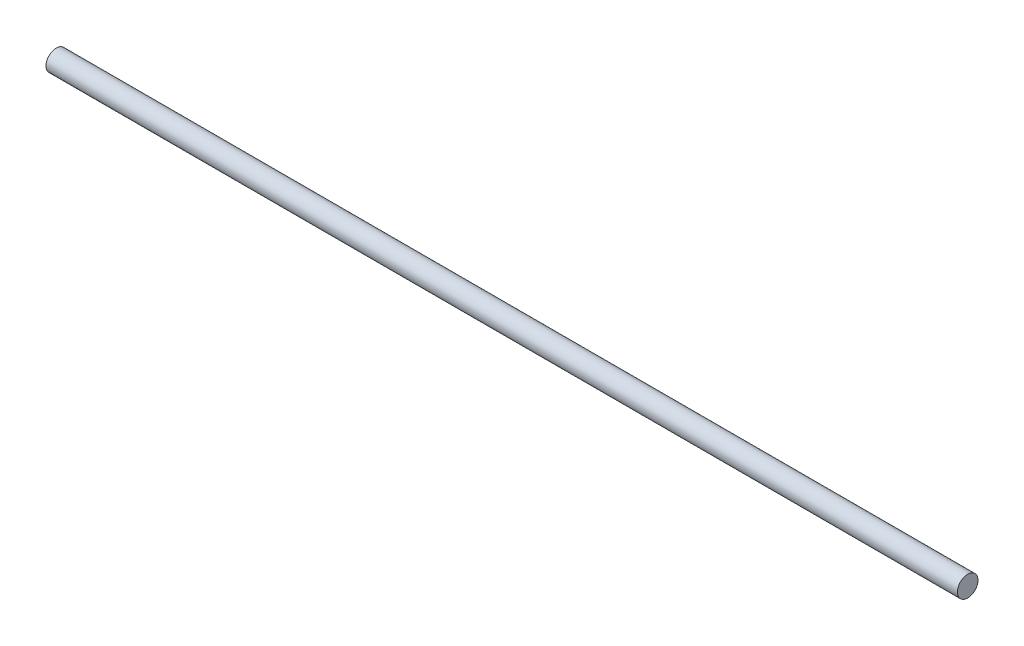
ISO-10303-21;
HEADER;
FILE_DESCRIPTION(('STEP AP214'),'2;1');
FILE_NAME('part.step','',(''),(''),'','','');
FILE_SCHEMA(('AUTOMOTIVE_DESIGN { 1 0 10303 214 1 1 1 1 }'));
ENDSEC;
DATA;
#1=APPLICATION_CONTEXT('core data for automotive mechanical design processes');
#2=APPLICATION_PROTOCOL_DEFINITION('international standard','automotive_design',2000,#1);
#3=PRODUCT_CONTEXT('',#1,'mechanical');
#4=PRODUCT('Part','Part','',(#3));
#5=PRODUCT_RELATED_PRODUCT_CATEGORY('part','',(#4));
#6=PRODUCT_DEFINITION_FORMATION('','',#4);
#7=PRODUCT_DEFINITION_CONTEXT('part definition',#1,'design');
#8=PRODUCT_DEFINITION('design','',#6,#7);
#9=PRODUCT_DEFINITION_SHAPE('','',#8);
#10=(LENGTH_UNIT() NAMED_UNIT(*) SI_UNIT(.MILLI.,.METRE.));
#11=(NAMED_UNIT(*) PLANE_ANGLE_UNIT() SI_UNIT($,.RADIAN.));
#12=(NAMED_UNIT(*) SI_UNIT($,.STERADIAN.) SOLID_ANGLE_UNIT());
#13=UNCERTAINTY_MEASURE_WITH_UNIT(LENGTH_MEASURE(1.E-05),#10,'distance_accuracy_value','');
#14=(GEOMETRIC_REPRESENTATION_CONTEXT(3) GLOBAL_UNCERTAINTY_ASSIGNED_CONTEXT((#13)) GLOBAL_UNIT_ASSIGNED_CONTEXT((#10,
#11,#12)) REPRESENTATION_CONTEXT('',''));
#15=CARTESIAN_POINT('',(0.,0.,0.));
#16=DIRECTION('',(0.,0.,1.));
#17=DIRECTION('',(1.,0.,0.));
#18=AXIS2_PLACEMENT_3D('',#15,#16,#17);
#19=CARTESIAN_POINT('',(398.,0.,0.));
#20=DIRECTION('',(-1.,0.,0.));
#21=DIRECTION('',(0.,0.,1.));
#22=AXIS2_PLACEMENT_3D('',#19,#20,#21);
#23=CYLINDRICAL_SURFACE('',#22,9.);
#24=CARTESIAN_POINT('',(398.,0.,0.));
#25=DIRECTION('',(1.,0.,0.));
#26=DIRECTION('',(0.,0.,-1.));
#27=AXIS2_PLACEMENT_3D('',#24,#25,#26);
#28=CIRCLE('',#27,9.);
#29=CARTESIAN_POINT('',(398.,0.,-9.));
#30=VERTEX_POINT('',#29);
#31=EDGE_CURVE('E10',#30,#30,#28,.T.);
#32=ORIENTED_EDGE('',*,*,#31,.F.);
#33=EDGE_LOOP('',(#32));
#34=FACE_BOUND('',#33,.T.);
#35=CARTESIAN_POINT('',(-398.,0.,0.));
#36=DIRECTION('',(1.,0.,0.));
#37=DIRECTION('',(0.,0.,-1.));
#38=AXIS2_PLACEMENT_3D('',#35,#36,#37);
#39=CIRCLE('',#38,9.);
#40=CARTESIAN_POINT('',(-398.,0.,-9.));
#41=VERTEX_POINT('',#40);
#42=EDGE_CURVE('E34',#41,#41,#39,.T.);
#43=ORIENTED_EDGE('',*,*,#42,.T.);
#44=EDGE_LOOP('',(#43));
#45=FACE_BOUND('',#44,.T.);
#46=ADVANCED_FACE('F31',(#34,#45),#23,.T.);
#47=CARTESIAN_POINT('',(398.,0.,0.));
#48=DIRECTION('',(1.,0.,0.));
#49=DIRECTION('',(0.,0.,-1.));
#50=AXIS2_PLACEMENT_3D('',#47,#48,#49);
#51=PLANE('',#50);
#52=ORIENTED_EDGE('',*,*,#31,.T.);
#53=EDGE_LOOP('',(#52));
#54=FACE_BOUND('',#53,.T.);
#55=ADVANCED_FACE('F46',(#54),#51,.T.);
#56=CARTESIAN_POINT('',(-398.,0.,0.));
#57=DIRECTION('',(1.,0.,0.));
#58=DIRECTION('',(0.,0.,-1.));
#59=AXIS2_PLACEMENT_3D('',#56,#57,#58);
#60=PLANE('',#59);
#61=ORIENTED_EDGE('',*,*,#42,.F.);
#62=EDGE_LOOP('',(#61));
#63=FACE_BOUND('',#62,.T.);
#64=ADVANCED_FACE('F44',(#63),#60,.F.);
#65=CLOSED_SHELL('',(#46,#55,#64));
#66=MANIFOLD_SOLID_BREP('B2',#65);
#67=ADVANCED_BREP_SHAPE_REPRESENTATION('',(#18,#66),#14);
#68=SHAPE_DEFINITION_REPRESENTATION(#9,#67);
ENDSEC;
END-ISO-10303-21;
